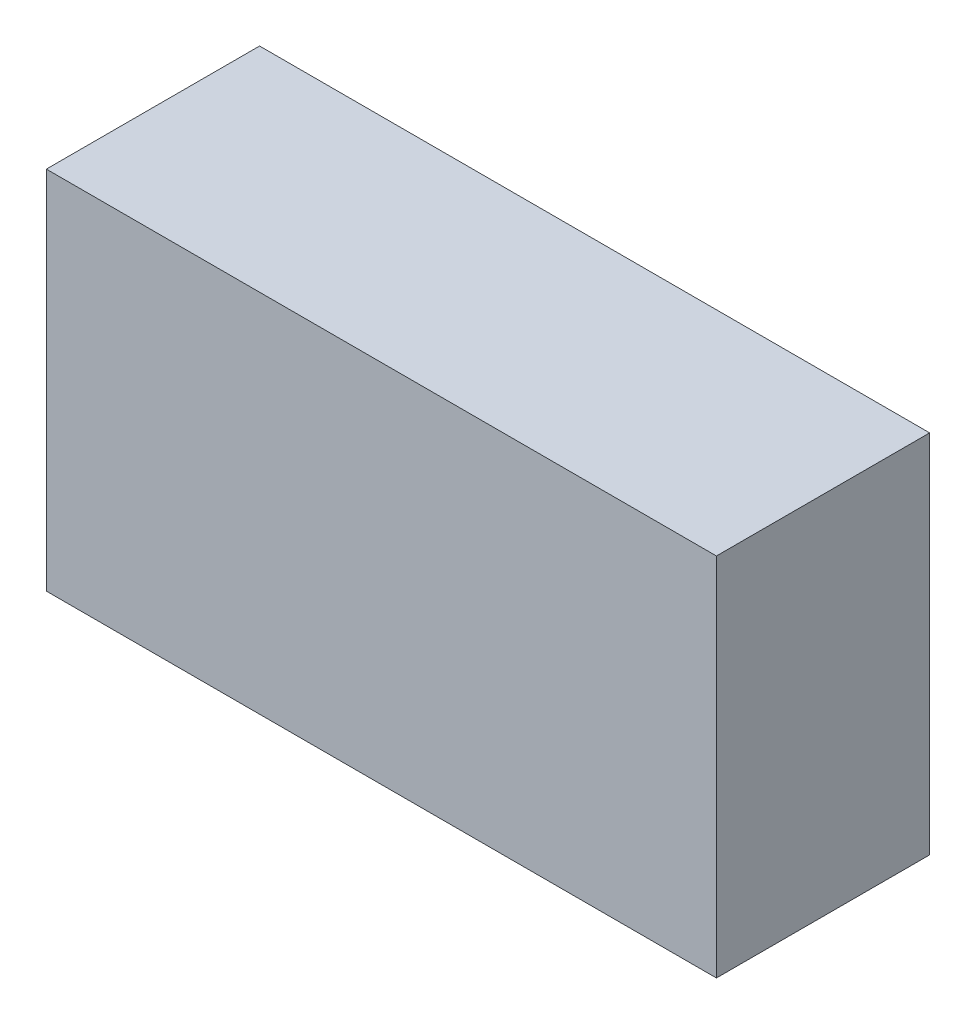
ISO-10303-21;
HEADER;
FILE_DESCRIPTION(('STEP AP214'),'2;1');
FILE_NAME('part.step','',(''),(''),'','','');
FILE_SCHEMA(('AUTOMOTIVE_DESIGN { 1 0 10303 214 1 1 1 1 }'));
ENDSEC;
DATA;
#1=APPLICATION_CONTEXT('core data for automotive mechanical design processes');
#2=APPLICATION_PROTOCOL_DEFINITION('international standard','automotive_design',2000,#1);
#3=PRODUCT_CONTEXT('',#1,'mechanical');
#4=PRODUCT('Part','Part','',(#3));
#5=PRODUCT_RELATED_PRODUCT_CATEGORY('part','',(#4));
#6=PRODUCT_DEFINITION_FORMATION('','',#4);
#7=PRODUCT_DEFINITION_CONTEXT('part definition',#1,'design');
#8=PRODUCT_DEFINITION('design','',#6,#7);
#9=PRODUCT_DEFINITION_SHAPE('','',#8);
#10=(LENGTH_UNIT() NAMED_UNIT(*) SI_UNIT(.MILLI.,.METRE.));
#11=(NAMED_UNIT(*) PLANE_ANGLE_UNIT() SI_UNIT($,.RADIAN.));
#12=(NAMED_UNIT(*) SI_UNIT($,.STERADIAN.) SOLID_ANGLE_UNIT());
#13=UNCERTAINTY_MEASURE_WITH_UNIT(LENGTH_MEASURE(1.E-05),#10,'distance_accuracy_value','');
#14=(GEOMETRIC_REPRESENTATION_CONTEXT(3) GLOBAL_UNCERTAINTY_ASSIGNED_CONTEXT((#13)) GLOBAL_UNIT_ASSIGNED_CONTEXT((#10,
#11,#12)) REPRESENTATION_CONTEXT('',''));
#15=CARTESIAN_POINT('',(0.,0.,0.));
#16=DIRECTION('',(0.,0.,1.));
#17=DIRECTION('',(1.,0.,0.));
#18=AXIS2_PLACEMENT_3D('',#15,#16,#17);
#19=CARTESIAN_POINT('',(0.,0.,0.35001));
#20=DIRECTION('',(0.,0.,1.));
#21=DIRECTION('',(1.,0.,0.));
#22=AXIS2_PLACEMENT_3D('',#19,#20,#21);
#23=PLANE('',#22);
#24=DIRECTION('',(1.,0.,0.));
#25=VECTOR('',#24,1.);
#26=CARTESIAN_POINT('',(-0.55,-0.3,0.35001));
#27=LINE('',#26,#25);
#28=CARTESIAN_POINT('',(-0.55,-0.3,0.35001));
#29=VERTEX_POINT('',#28);
#30=CARTESIAN_POINT('',(0.55,-0.3,0.35001));
#31=VERTEX_POINT('',#30);
#32=EDGE_CURVE('E95',#29,#31,#27,.T.);
#33=ORIENTED_EDGE('',*,*,#32,.T.);
#34=DIRECTION('',(0.,1.,0.));
#35=VECTOR('',#34,1.);
#36=CARTESIAN_POINT('',(0.55,-0.3,0.35001));
#37=LINE('',#36,#35);
#38=CARTESIAN_POINT('',(0.55,0.3,0.35001));
#39=VERTEX_POINT('',#38);
#40=EDGE_CURVE('E84',#31,#39,#37,.T.);
#41=ORIENTED_EDGE('',*,*,#40,.T.);
#42=DIRECTION('',(-1.,0.,0.));
#43=VECTOR('',#42,1.);
#44=CARTESIAN_POINT('',(0.55,0.3,0.35001));
#45=LINE('',#44,#43);
#46=CARTESIAN_POINT('',(-0.55,0.3,0.35001));
#47=VERTEX_POINT('',#46);
#48=EDGE_CURVE('E76',#39,#47,#45,.T.);
#49=ORIENTED_EDGE('',*,*,#48,.T.);
#50=DIRECTION('',(0.,-1.,0.));
#51=VECTOR('',#50,1.);
#52=CARTESIAN_POINT('',(-0.55,0.3,0.35001));
#53=LINE('',#52,#51);
#54=EDGE_CURVE('E11',#47,#29,#53,.T.);
#55=ORIENTED_EDGE('',*,*,#54,.T.);
#56=EDGE_LOOP('',(#33,#41,#49,#55));
#57=FACE_BOUND('',#56,.T.);
#58=ADVANCED_FACE('F16',(#57),#23,.T.);
#59=CARTESIAN_POINT('',(0.,0.,0.));
#60=DIRECTION('',(0.,0.,1.));
#61=DIRECTION('',(1.,0.,0.));
#62=AXIS2_PLACEMENT_3D('',#59,#60,#61);
#63=PLANE('',#62);
#64=DIRECTION('',(1.,0.,0.));
#65=VECTOR('',#64,1.);
#66=CARTESIAN_POINT('',(-0.55,-0.3,0.));
#67=LINE('',#66,#65);
#68=CARTESIAN_POINT('',(-0.55,-0.3,0.));
#69=VERTEX_POINT('',#68);
#70=CARTESIAN_POINT('',(0.55,-0.3,0.));
#71=VERTEX_POINT('',#70);
#72=EDGE_CURVE('E114',#69,#71,#67,.T.);
#73=ORIENTED_EDGE('',*,*,#72,.F.);
#74=DIRECTION('',(0.,-1.,0.));
#75=VECTOR('',#74,1.);
#76=CARTESIAN_POINT('',(-0.55,0.3,0.));
#77=LINE('',#76,#75);
#78=CARTESIAN_POINT('',(-0.55,0.3,0.));
#79=VERTEX_POINT('',#78);
#80=EDGE_CURVE('E27',#79,#69,#77,.T.);
#81=ORIENTED_EDGE('',*,*,#80,.F.);
#82=DIRECTION('',(-1.,0.,0.));
#83=VECTOR('',#82,1.);
#84=CARTESIAN_POINT('',(0.55,0.3,0.));
#85=LINE('',#84,#83);
#86=CARTESIAN_POINT('',(0.55,0.3,0.));
#87=VERTEX_POINT('',#86);
#88=EDGE_CURVE('E80',#87,#79,#85,.T.);
#89=ORIENTED_EDGE('',*,*,#88,.F.);
#90=DIRECTION('',(0.,1.,0.));
#91=VECTOR('',#90,1.);
#92=CARTESIAN_POINT('',(0.55,-0.3,0.));
#93=LINE('',#92,#91);
#94=EDGE_CURVE('E55',#71,#87,#93,.T.);
#95=ORIENTED_EDGE('',*,*,#94,.F.);
#96=EDGE_LOOP('',(#73,#81,#89,#95));
#97=FACE_BOUND('',#96,.T.);
#98=ADVANCED_FACE('F81',(#97),#63,.F.);
#99=CARTESIAN_POINT('',(-0.55,0.3,0.));
#100=DIRECTION('',(1.,0.,0.));
#101=DIRECTION('',(0.,1.,0.));
#102=AXIS2_PLACEMENT_3D('',#99,#100,#101);
#103=PLANE('',#102);
#104=DIRECTION('',(0.,0.,1.));
#105=VECTOR('',#104,1.);
#106=CARTESIAN_POINT('',(-0.55,0.3,0.));
#107=LINE('',#106,#105);
#108=EDGE_CURVE('E83',#79,#47,#107,.T.);
#109=ORIENTED_EDGE('',*,*,#108,.F.);
#110=ORIENTED_EDGE('',*,*,#80,.T.);
#111=DIRECTION('',(0.,0.,1.));
#112=VECTOR('',#111,1.);
#113=CARTESIAN_POINT('',(-0.55,-0.3,0.));
#114=LINE('',#113,#112);
#115=EDGE_CURVE('E102',#69,#29,#114,.T.);
#116=ORIENTED_EDGE('',*,*,#115,.T.);
#117=ORIENTED_EDGE('',*,*,#54,.F.);
#118=EDGE_LOOP('',(#109,#110,#116,#117));
#119=FACE_BOUND('',#118,.T.);
#120=ADVANCED_FACE('F120',(#119),#103,.F.);
#121=CARTESIAN_POINT('',(0.55,0.3,0.));
#122=DIRECTION('',(0.,-1.,0.));
#123=DIRECTION('',(0.,0.,-1.));
#124=AXIS2_PLACEMENT_3D('',#121,#122,#123);
#125=PLANE('',#124);
#126=DIRECTION('',(0.,0.,1.));
#127=VECTOR('',#126,1.);
#128=CARTESIAN_POINT('',(0.55,0.3,0.));
#129=LINE('',#128,#127);
#130=EDGE_CURVE('E87',#87,#39,#129,.T.);
#131=ORIENTED_EDGE('',*,*,#130,.F.);
#132=ORIENTED_EDGE('',*,*,#88,.T.);
#133=ORIENTED_EDGE('',*,*,#108,.T.);
#134=ORIENTED_EDGE('',*,*,#48,.F.);
#135=EDGE_LOOP('',(#131,#132,#133,#134));
#136=FACE_BOUND('',#135,.T.);
#137=ADVANCED_FACE('F18',(#136),#125,.F.);
#138=CARTESIAN_POINT('',(0.55,-0.3,0.));
#139=DIRECTION('',(-1.,0.,0.));
#140=DIRECTION('',(0.,0.,1.));
#141=AXIS2_PLACEMENT_3D('',#138,#139,#140);
#142=PLANE('',#141);
#143=DIRECTION('',(0.,0.,1.));
#144=VECTOR('',#143,1.);
#145=CARTESIAN_POINT('',(0.55,-0.3,0.));
#146=LINE('',#145,#144);
#147=EDGE_CURVE('E20',#71,#31,#146,.T.);
#148=ORIENTED_EDGE('',*,*,#147,.F.);
#149=ORIENTED_EDGE('',*,*,#94,.T.);
#150=ORIENTED_EDGE('',*,*,#130,.T.);
#151=ORIENTED_EDGE('',*,*,#40,.F.);
#152=EDGE_LOOP('',(#148,#149,#150,#151));
#153=FACE_BOUND('',#152,.T.);
#154=ADVANCED_FACE('F91',(#153),#142,.F.);
#155=CARTESIAN_POINT('',(-0.55,-0.3,0.));
#156=DIRECTION('',(0.,1.,0.));
#157=DIRECTION('',(1.,0.,0.));
#158=AXIS2_PLACEMENT_3D('',#155,#156,#157);
#159=PLANE('',#158);
#160=ORIENTED_EDGE('',*,*,#115,.F.);
#161=ORIENTED_EDGE('',*,*,#72,.T.);
#162=ORIENTED_EDGE('',*,*,#147,.T.);
#163=ORIENTED_EDGE('',*,*,#32,.F.);
#164=EDGE_LOOP('',(#160,#161,#162,#163));
#165=FACE_BOUND('',#164,.T.);
#166=ADVANCED_FACE('F121',(#165),#159,.F.);
#167=CLOSED_SHELL('',(#58,#98,#120,#137,#154,#166));
#168=MANIFOLD_SOLID_BREP('B1',#167);
#169=ADVANCED_BREP_SHAPE_REPRESENTATION('',(#18,#168),#14);
#170=SHAPE_DEFINITION_REPRESENTATION(#9,#169);
ENDSEC;
END-ISO-10303-21;
